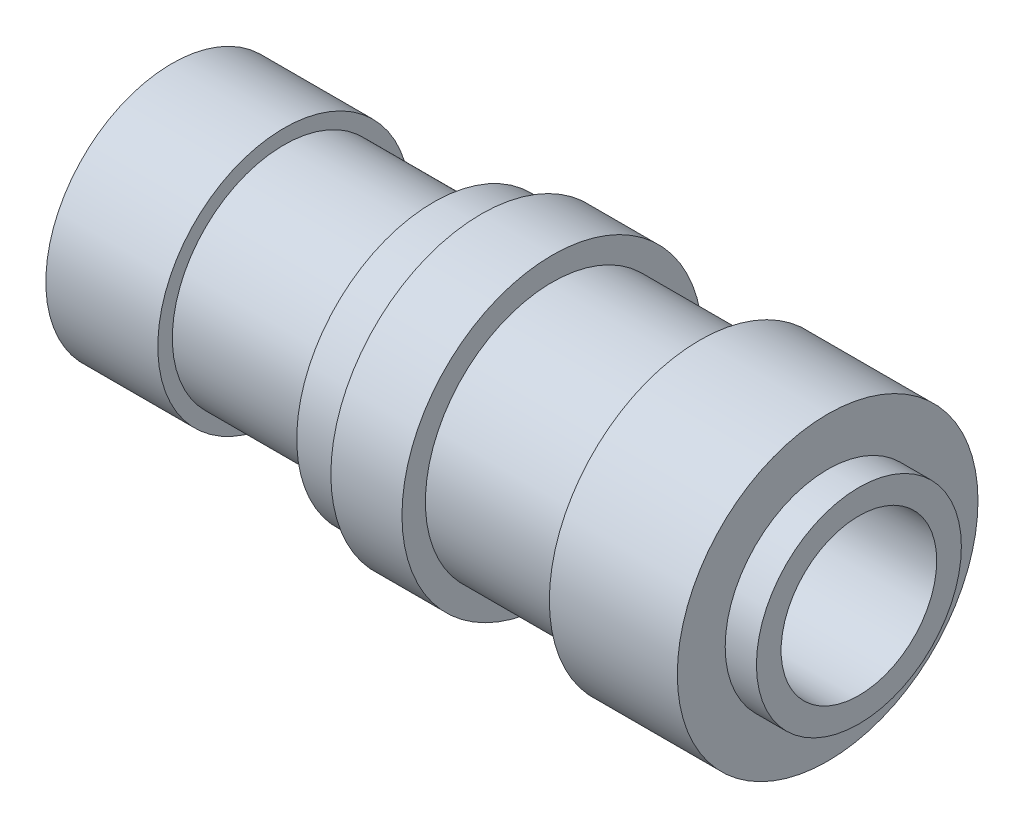
ISO-10303-21;
HEADER;
FILE_DESCRIPTION(('STEP AP214'),'2;1');
FILE_NAME('part.step','',(''),(''),'','','');
FILE_SCHEMA(('AUTOMOTIVE_DESIGN { 1 0 10303 214 1 1 1 1 }'));
ENDSEC;
DATA;
#1=APPLICATION_CONTEXT('core data for automotive mechanical design processes');
#2=APPLICATION_PROTOCOL_DEFINITION('international standard','automotive_design',2000,#1);
#3=PRODUCT_CONTEXT('',#1,'mechanical');
#4=PRODUCT('Part','Part','',(#3));
#5=PRODUCT_RELATED_PRODUCT_CATEGORY('part','',(#4));
#6=PRODUCT_DEFINITION_FORMATION('','',#4);
#7=PRODUCT_DEFINITION_CONTEXT('part definition',#1,'design');
#8=PRODUCT_DEFINITION('design','',#6,#7);
#9=PRODUCT_DEFINITION_SHAPE('','',#8);
#10=(LENGTH_UNIT() NAMED_UNIT(*) SI_UNIT(.MILLI.,.METRE.));
#11=(NAMED_UNIT(*) PLANE_ANGLE_UNIT() SI_UNIT($,.RADIAN.));
#12=(NAMED_UNIT(*) SI_UNIT($,.STERADIAN.) SOLID_ANGLE_UNIT());
#13=UNCERTAINTY_MEASURE_WITH_UNIT(LENGTH_MEASURE(1.E-05),#10,'distance_accuracy_value','');
#14=(GEOMETRIC_REPRESENTATION_CONTEXT(3) GLOBAL_UNCERTAINTY_ASSIGNED_CONTEXT((#13)) GLOBAL_UNIT_ASSIGNED_CONTEXT((#10,
#11,#12)) REPRESENTATION_CONTEXT('',''));
#15=CARTESIAN_POINT('',(0.,0.,0.));
#16=DIRECTION('',(0.,0.,1.));
#17=DIRECTION('',(1.,0.,0.));
#18=AXIS2_PLACEMENT_3D('',#15,#16,#17);
#19=CARTESIAN_POINT('',(-5.83134018582006,0.,0.));
#20=DIRECTION('',(-1.,0.,0.));
#21=DIRECTION('',(0.,0.,1.));
#22=AXIS2_PLACEMENT_3D('',#19,#20,#21);
#23=PLANE('',#22);
#24=CARTESIAN_POINT('',(-5.83134018582007,0.,0.));
#25=DIRECTION('',(1.,0.,0.));
#26=DIRECTION('',(0.,0.,-1.));
#27=AXIS2_PLACEMENT_3D('',#24,#25,#26);
#28=CIRCLE('',#27,7.366);
#29=CARTESIAN_POINT('',(-5.83134018582007,0.,-7.366));
#30=VERTEX_POINT('',#29);
#31=EDGE_CURVE('E106',#30,#30,#28,.T.);
#32=ORIENTED_EDGE('',*,*,#31,.T.);
#33=EDGE_LOOP('',(#32));
#34=FACE_BOUND('',#33,.T.);
#35=CARTESIAN_POINT('',(-5.83134018582007,0.,0.));
#36=DIRECTION('',(1.,0.,0.));
#37=DIRECTION('',(0.,0.,-1.));
#38=AXIS2_PLACEMENT_3D('',#35,#36,#37);
#39=CIRCLE('',#38,11.938);
#40=CARTESIAN_POINT('',(-5.83134018582007,0.,-11.938));
#41=VERTEX_POINT('',#40);
#42=EDGE_CURVE('E10',#41,#41,#39,.T.);
#43=ORIENTED_EDGE('',*,*,#42,.F.);
#44=EDGE_LOOP('',(#43));
#45=FACE_BOUND('',#44,.T.);
#46=ADVANCED_FACE('F43',(#34,#45),#23,.T.);
#47=CARTESIAN_POINT('',(59.1926598141799,0.,0.));
#48=DIRECTION('',(1.,0.,0.));
#49=DIRECTION('',(0.,0.,-1.));
#50=AXIS2_PLACEMENT_3D('',#47,#48,#49);
#51=CYLINDRICAL_SURFACE('',#50,11.938);
#52=ORIENTED_EDGE('',*,*,#42,.T.);
#53=EDGE_LOOP('',(#52));
#54=FACE_BOUND('',#53,.T.);
#55=CARTESIAN_POINT('',(4.76711822253859,0.,0.));
#56=DIRECTION('',(1.,0.,0.));
#57=DIRECTION('',(0.,0.,-1.));
#58=AXIS2_PLACEMENT_3D('',#55,#56,#57);
#59=CIRCLE('',#58,11.938);
#60=CARTESIAN_POINT('',(4.76711822253858,0.,-11.938));
#61=VERTEX_POINT('',#60);
#62=EDGE_CURVE('E51',#61,#61,#59,.T.);
#63=ORIENTED_EDGE('',*,*,#62,.F.);
#64=EDGE_LOOP('',(#63));
#65=FACE_BOUND('',#64,.T.);
#66=ADVANCED_FACE('F136',(#54,#65),#51,.T.);
#67=CARTESIAN_POINT('',(4.76711822253858,0.,-11.938));
#68=DIRECTION('',(1.,0.,0.));
#69=DIRECTION('',(0.,0.,-1.));
#70=AXIS2_PLACEMENT_3D('',#67,#68,#69);
#71=PLANE('',#70);
#72=ORIENTED_EDGE('',*,*,#62,.T.);
#73=EDGE_LOOP('',(#72));
#74=FACE_BOUND('',#73,.T.);
#75=CARTESIAN_POINT('',(4.76711822253859,0.,0.));
#76=DIRECTION('',(1.,0.,0.));
#77=DIRECTION('',(0.,0.,-1.));
#78=AXIS2_PLACEMENT_3D('',#75,#76,#77);
#79=CIRCLE('',#78,10.5639485769045);
#80=CARTESIAN_POINT('',(4.76711822253858,0.,-10.5639485769045));
#81=VERTEX_POINT('',#80);
#82=EDGE_CURVE('E56',#81,#81,#79,.T.);
#83=ORIENTED_EDGE('',*,*,#82,.F.);
#84=EDGE_LOOP('',(#83));
#85=FACE_BOUND('',#84,.T.);
#86=ADVANCED_FACE('F140',(#74,#85),#71,.T.);
#87=CARTESIAN_POINT('',(59.1926598141799,0.,0.));
#88=DIRECTION('',(1.,0.,0.));
#89=DIRECTION('',(0.,0.,-1.));
#90=AXIS2_PLACEMENT_3D('',#87,#88,#89);
#91=CYLINDRICAL_SURFACE('',#90,10.5639485769045);
#92=ORIENTED_EDGE('',*,*,#82,.T.);
#93=EDGE_LOOP('',(#92));
#94=FACE_BOUND('',#93,.T.);
#95=CARTESIAN_POINT('',(18.9276644976126,0.,0.));
#96=DIRECTION('',(1.,0.,0.));
#97=DIRECTION('',(0.,0.,-1.));
#98=AXIS2_PLACEMENT_3D('',#95,#96,#97);
#99=CIRCLE('',#98,10.5639485769044);
#100=CARTESIAN_POINT('',(18.9276644976126,0.,-10.5639485769045));
#101=VERTEX_POINT('',#100);
#102=EDGE_CURVE('E62',#101,#101,#99,.T.);
#103=ORIENTED_EDGE('',*,*,#102,.F.);
#104=EDGE_LOOP('',(#103));
#105=FACE_BOUND('',#104,.T.);
#106=ADVANCED_FACE('F145',(#94,#105),#91,.T.);
#107=CARTESIAN_POINT('',(18.9276644976126,0.,-10.5639485769045));
#108=DIRECTION('',(-1.,0.,0.));
#109=DIRECTION('',(0.,0.,1.));
#110=AXIS2_PLACEMENT_3D('',#107,#108,#109);
#111=PLANE('',#110);
#112=ORIENTED_EDGE('',*,*,#102,.T.);
#113=EDGE_LOOP('',(#112));
#114=FACE_BOUND('',#113,.T.);
#115=CARTESIAN_POINT('',(18.9276644976126,0.,0.));
#116=DIRECTION('',(1.,0.,0.));
#117=DIRECTION('',(0.,0.,-1.));
#118=AXIS2_PLACEMENT_3D('',#115,#116,#117);
#119=CIRCLE('',#118,12.9487273974774);
#120=CARTESIAN_POINT('',(18.9276644976126,0.,-12.9487273974774));
#121=VERTEX_POINT('',#120);
#122=EDGE_CURVE('E66',#121,#121,#119,.T.);
#123=ORIENTED_EDGE('',*,*,#122,.F.);
#124=EDGE_LOOP('',(#123));
#125=FACE_BOUND('',#124,.T.);
#126=ADVANCED_FACE('F152',(#114,#125),#111,.T.);
#127=CARTESIAN_POINT('',(59.1926598141799,0.,0.));
#128=DIRECTION('',(1.,0.,0.));
#129=DIRECTION('',(0.,0.,-1.));
#130=AXIS2_PLACEMENT_3D('',#127,#128,#129);
#131=CYLINDRICAL_SURFACE('',#130,12.9487273974774);
#132=ORIENTED_EDGE('',*,*,#122,.T.);
#133=EDGE_LOOP('',(#132));
#134=FACE_BOUND('',#133,.T.);
#135=CARTESIAN_POINT('',(23.4412887563629,0.,0.));
#136=DIRECTION('',(1.,0.,0.));
#137=DIRECTION('',(0.,0.,-1.));
#138=AXIS2_PLACEMENT_3D('',#135,#136,#137);
#139=CIRCLE('',#138,12.9487273974774);
#140=CARTESIAN_POINT('',(23.4412887563629,0.,-12.9487273974774));
#141=VERTEX_POINT('',#140);
#142=EDGE_CURVE('E70',#141,#141,#139,.T.);
#143=ORIENTED_EDGE('',*,*,#142,.F.);
#144=EDGE_LOOP('',(#143));
#145=FACE_BOUND('',#144,.T.);
#146=ADVANCED_FACE('F156',(#134,#145),#131,.T.);
#147=CARTESIAN_POINT('',(23.4412887563629,0.,-12.9487273974774));
#148=DIRECTION('',(-1.,0.,0.));
#149=DIRECTION('',(0.,0.,1.));
#150=AXIS2_PLACEMENT_3D('',#147,#148,#149);
#151=PLANE('',#150);
#152=ORIENTED_EDGE('',*,*,#142,.T.);
#153=EDGE_LOOP('',(#152));
#154=FACE_BOUND('',#153,.T.);
#155=CARTESIAN_POINT('',(23.4412887563629,0.,0.));
#156=DIRECTION('',(1.,0.,0.));
#157=DIRECTION('',(0.,0.,-1.));
#158=AXIS2_PLACEMENT_3D('',#155,#156,#157);
#159=CIRCLE('',#158,14.2310070164406);
#160=CARTESIAN_POINT('',(23.4412887563629,0.,-14.2310070164406));
#161=VERTEX_POINT('',#160);
#162=EDGE_CURVE('E74',#161,#161,#159,.T.);
#163=ORIENTED_EDGE('',*,*,#162,.F.);
#164=EDGE_LOOP('',(#163));
#165=FACE_BOUND('',#164,.T.);
#166=ADVANCED_FACE('F160',(#154,#165),#151,.T.);
#167=CARTESIAN_POINT('',(59.1926598141799,0.,0.));
#168=DIRECTION('',(1.,0.,0.));
#169=DIRECTION('',(0.,0.,-1.));
#170=AXIS2_PLACEMENT_3D('',#167,#168,#169);
#171=CYLINDRICAL_SURFACE('',#170,14.2310070164406);
#172=ORIENTED_EDGE('',*,*,#162,.T.);
#173=EDGE_LOOP('',(#172));
#174=FACE_BOUND('',#173,.T.);
#175=CARTESIAN_POINT('',(30.1706921966814,0.,0.));
#176=DIRECTION('',(1.,0.,0.));
#177=DIRECTION('',(0.,0.,-1.));
#178=AXIS2_PLACEMENT_3D('',#175,#176,#177);
#179=CIRCLE('',#178,14.2310070164406);
#180=CARTESIAN_POINT('',(30.1706921966814,0.,-14.2310070164406));
#181=VERTEX_POINT('',#180);
#182=EDGE_CURVE('E78',#181,#181,#179,.T.);
#183=ORIENTED_EDGE('',*,*,#182,.F.);
#184=EDGE_LOOP('',(#183));
#185=FACE_BOUND('',#184,.T.);
#186=ADVANCED_FACE('F164',(#174,#185),#171,.T.);
#187=CARTESIAN_POINT('',(30.1706921966814,0.,-14.2310070164406));
#188=DIRECTION('',(1.,0.,0.));
#189=DIRECTION('',(0.,0.,-1.));
#190=AXIS2_PLACEMENT_3D('',#187,#188,#189);
#191=PLANE('',#190);
#192=ORIENTED_EDGE('',*,*,#182,.T.);
#193=EDGE_LOOP('',(#192));
#194=FACE_BOUND('',#193,.T.);
#195=CARTESIAN_POINT('',(30.1706921966814,0.,0.));
#196=DIRECTION('',(1.,0.,0.));
#197=DIRECTION('',(0.,0.,-1.));
#198=AXIS2_PLACEMENT_3D('',#195,#196,#197);
#199=CIRCLE('',#198,12.0134052610235);
#200=CARTESIAN_POINT('',(30.1706921966814,0.,-12.0134052610235));
#201=VERTEX_POINT('',#200);
#202=EDGE_CURVE('E82',#201,#201,#199,.T.);
#203=ORIENTED_EDGE('',*,*,#202,.F.);
#204=EDGE_LOOP('',(#203));
#205=FACE_BOUND('',#204,.T.);
#206=ADVANCED_FACE('F168',(#194,#205),#191,.T.);
#207=CARTESIAN_POINT('',(59.1926598141799,0.,0.));
#208=DIRECTION('',(1.,0.,0.));
#209=DIRECTION('',(0.,0.,-1.));
#210=AXIS2_PLACEMENT_3D('',#207,#208,#209);
#211=CYLINDRICAL_SURFACE('',#210,12.0134052610235);
#212=ORIENTED_EDGE('',*,*,#202,.T.);
#213=EDGE_LOOP('',(#212));
#214=FACE_BOUND('',#213,.T.);
#215=CARTESIAN_POINT('',(44.1218944510003,0.,0.));
#216=DIRECTION('',(1.,0.,0.));
#217=DIRECTION('',(0.,0.,-1.));
#218=AXIS2_PLACEMENT_3D('',#215,#216,#217);
#219=CIRCLE('',#218,12.0134052610235);
#220=CARTESIAN_POINT('',(44.1218944510003,0.,-12.0134052610235));
#221=VERTEX_POINT('',#220);
#222=EDGE_CURVE('E86',#221,#221,#219,.T.);
#223=ORIENTED_EDGE('',*,*,#222,.F.);
#224=EDGE_LOOP('',(#223));
#225=FACE_BOUND('',#224,.T.);
#226=ADVANCED_FACE('F172',(#214,#225),#211,.T.);
#227=CARTESIAN_POINT('',(44.1218944510003,0.,-12.0134052610235));
#228=DIRECTION('',(-1.,0.,0.));
#229=DIRECTION('',(0.,0.,1.));
#230=AXIS2_PLACEMENT_3D('',#227,#228,#229);
#231=PLANE('',#230);
#232=ORIENTED_EDGE('',*,*,#222,.T.);
#233=EDGE_LOOP('',(#232));
#234=FACE_BOUND('',#233,.T.);
#235=CARTESIAN_POINT('',(44.1218944510003,0.,0.));
#236=DIRECTION('',(1.,0.,0.));
#237=DIRECTION('',(0.,0.,-1.));
#238=AXIS2_PLACEMENT_3D('',#235,#236,#237);
#239=CIRCLE('',#238,14.2310070164406);
#240=CARTESIAN_POINT('',(44.1218944510003,0.,-14.2310070164406));
#241=VERTEX_POINT('',#240);
#242=EDGE_CURVE('E90',#241,#241,#239,.T.);
#243=ORIENTED_EDGE('',*,*,#242,.F.);
#244=EDGE_LOOP('',(#243));
#245=FACE_BOUND('',#244,.T.);
#246=ADVANCED_FACE('F176',(#234,#245),#231,.T.);
#247=CARTESIAN_POINT('',(59.1926598141799,0.,0.));
#248=DIRECTION('',(1.,0.,0.));
#249=DIRECTION('',(0.,0.,-1.));
#250=AXIS2_PLACEMENT_3D('',#247,#248,#249);
#251=CYLINDRICAL_SURFACE('',#250,14.2310070164406);
#252=ORIENTED_EDGE('',*,*,#242,.T.);
#253=EDGE_LOOP('',(#252));
#254=FACE_BOUND('',#253,.T.);
#255=CARTESIAN_POINT('',(56.2351692304914,0.,0.));
#256=DIRECTION('',(1.,0.,0.));
#257=DIRECTION('',(0.,0.,-1.));
#258=AXIS2_PLACEMENT_3D('',#255,#256,#257);
#259=CIRCLE('',#258,14.2310070164406);
#260=CARTESIAN_POINT('',(56.2351692304914,0.,-14.2310070164406));
#261=VERTEX_POINT('',#260);
#262=EDGE_CURVE('E94',#261,#261,#259,.T.);
#263=ORIENTED_EDGE('',*,*,#262,.F.);
#264=EDGE_LOOP('',(#263));
#265=FACE_BOUND('',#264,.T.);
#266=ADVANCED_FACE('F133',(#254,#265),#251,.T.);
#267=CARTESIAN_POINT('',(56.2351692304914,0.,-14.2310070164406));
#268=DIRECTION('',(1.,0.,0.));
#269=DIRECTION('',(0.,0.,-1.));
#270=AXIS2_PLACEMENT_3D('',#267,#268,#269);
#271=PLANE('',#270);
#272=ORIENTED_EDGE('',*,*,#262,.T.);
#273=EDGE_LOOP('',(#272));
#274=FACE_BOUND('',#273,.T.);
#275=CARTESIAN_POINT('',(56.2351692304914,0.,0.));
#276=DIRECTION('',(1.,0.,0.));
#277=DIRECTION('',(0.,0.,-1.));
#278=AXIS2_PLACEMENT_3D('',#275,#276,#277);
#279=CIRCLE('',#278,9.70002570442158);
#280=CARTESIAN_POINT('',(56.2351692304914,0.,-9.70002570442158));
#281=VERTEX_POINT('',#280);
#282=EDGE_CURVE('E98',#281,#281,#279,.T.);
#283=ORIENTED_EDGE('',*,*,#282,.F.);
#284=EDGE_LOOP('',(#283));
#285=FACE_BOUND('',#284,.T.);
#286=ADVANCED_FACE('F126',(#274,#285),#271,.T.);
#287=CARTESIAN_POINT('',(59.1926598141799,0.,0.));
#288=DIRECTION('',(1.,0.,0.));
#289=DIRECTION('',(0.,0.,-1.));
#290=AXIS2_PLACEMENT_3D('',#287,#288,#289);
#291=CYLINDRICAL_SURFACE('',#290,9.70002570442158);
#292=ORIENTED_EDGE('',*,*,#282,.T.);
#293=EDGE_LOOP('',(#292));
#294=FACE_BOUND('',#293,.T.);
#295=CARTESIAN_POINT('',(59.1926598141799,0.,0.));
#296=DIRECTION('',(1.,0.,0.));
#297=DIRECTION('',(0.,0.,-1.));
#298=AXIS2_PLACEMENT_3D('',#295,#296,#297);
#299=CIRCLE('',#298,9.70002570442158);
#300=CARTESIAN_POINT('',(59.1926598141799,0.,-9.70002570442158));
#301=VERTEX_POINT('',#300);
#302=EDGE_CURVE('E102',#301,#301,#299,.T.);
#303=ORIENTED_EDGE('',*,*,#302,.F.);
#304=EDGE_LOOP('',(#303));
#305=FACE_BOUND('',#304,.T.);
#306=ADVANCED_FACE('F121',(#294,#305),#291,.T.);
#307=CARTESIAN_POINT('',(59.1926598141799,0.,-9.70002570442158));
#308=DIRECTION('',(1.,0.,0.));
#309=DIRECTION('',(0.,0.,-1.));
#310=AXIS2_PLACEMENT_3D('',#307,#308,#309);
#311=PLANE('',#310);
#312=CARTESIAN_POINT('',(59.1926598141799,0.,0.));
#313=DIRECTION('',(1.,0.,0.));
#314=DIRECTION('',(0.,0.,-1.));
#315=AXIS2_PLACEMENT_3D('',#312,#313,#314);
#316=CIRCLE('',#315,7.366);
#317=CARTESIAN_POINT('',(59.1926598141799,0.,-7.366));
#318=VERTEX_POINT('',#317);
#319=EDGE_CURVE('E46',#318,#318,#316,.T.);
#320=ORIENTED_EDGE('',*,*,#319,.F.);
#321=EDGE_LOOP('',(#320));
#322=FACE_BOUND('',#321,.T.);
#323=ORIENTED_EDGE('',*,*,#302,.T.);
#324=EDGE_LOOP('',(#323));
#325=FACE_BOUND('',#324,.T.);
#326=ADVANCED_FACE('F118',(#322,#325),#311,.T.);
#327=CARTESIAN_POINT('',(-5.83134018582007,0.,0.));
#328=DIRECTION('',(1.,0.,0.));
#329=DIRECTION('',(0.,0.,-1.));
#330=AXIS2_PLACEMENT_3D('',#327,#328,#329);
#331=CYLINDRICAL_SURFACE('',#330,7.366);
#332=ORIENTED_EDGE('',*,*,#319,.T.);
#333=EDGE_LOOP('',(#332));
#334=FACE_BOUND('',#333,.T.);
#335=ORIENTED_EDGE('',*,*,#31,.F.);
#336=EDGE_LOOP('',(#335));
#337=FACE_BOUND('',#336,.T.);
#338=ADVANCED_FACE('F115',(#334,#337),#331,.F.);
#339=CLOSED_SHELL('',(#46,#66,#86,#106,#126,#146,#166,#186,#206,#226,#246,#266,#286,#306,#326,#338));
#340=MANIFOLD_SOLID_BREP('B2',#339);
#341=ADVANCED_BREP_SHAPE_REPRESENTATION('',(#18,#340),#14);
#342=SHAPE_DEFINITION_REPRESENTATION(#9,#341);
ENDSEC;
END-ISO-10303-21;
